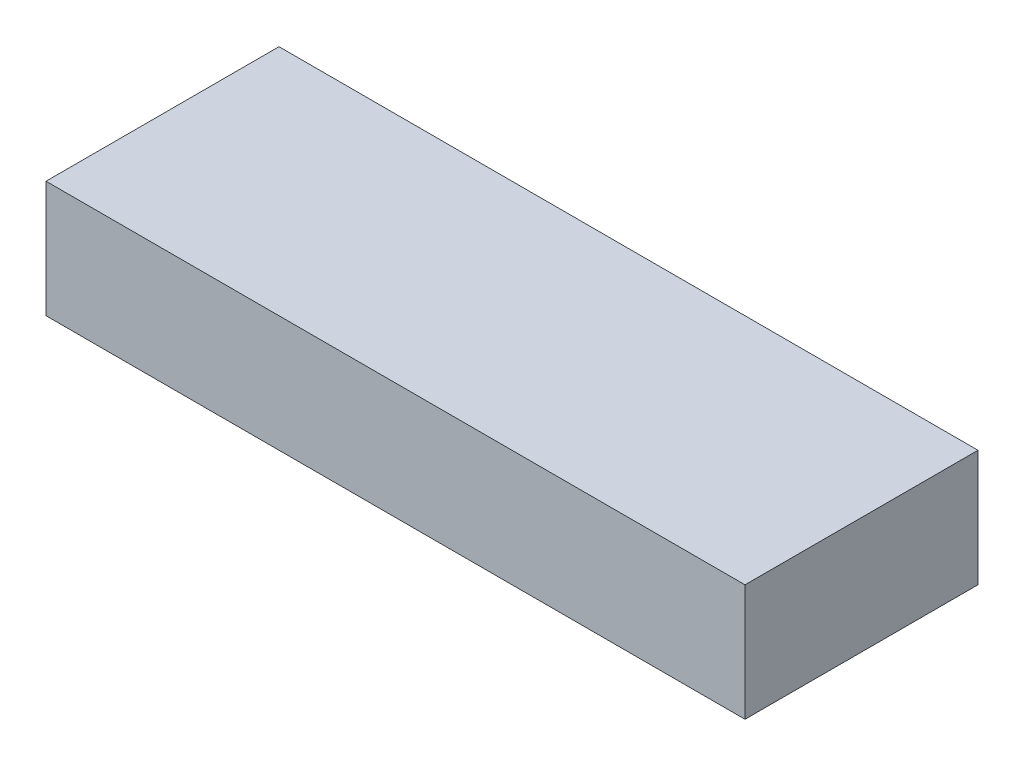
ISO-10303-21;
HEADER;
FILE_DESCRIPTION(('STEP AP214'),'2;1');
FILE_NAME('part.step','',(''),(''),'','','');
FILE_SCHEMA(('AUTOMOTIVE_DESIGN { 1 0 10303 214 1 1 1 1 }'));
ENDSEC;
DATA;
#1=APPLICATION_CONTEXT('core data for automotive mechanical design processes');
#2=APPLICATION_PROTOCOL_DEFINITION('international standard','automotive_design',2000,#1);
#3=PRODUCT_CONTEXT('',#1,'mechanical');
#4=PRODUCT('Part','Part','',(#3));
#5=PRODUCT_RELATED_PRODUCT_CATEGORY('part','',(#4));
#6=PRODUCT_DEFINITION_FORMATION('','',#4);
#7=PRODUCT_DEFINITION_CONTEXT('part definition',#1,'design');
#8=PRODUCT_DEFINITION('design','',#6,#7);
#9=PRODUCT_DEFINITION_SHAPE('','',#8);
#10=(LENGTH_UNIT() NAMED_UNIT(*) SI_UNIT(.MILLI.,.METRE.));
#11=(NAMED_UNIT(*) PLANE_ANGLE_UNIT() SI_UNIT($,.RADIAN.));
#12=(NAMED_UNIT(*) SI_UNIT($,.STERADIAN.) SOLID_ANGLE_UNIT());
#13=UNCERTAINTY_MEASURE_WITH_UNIT(LENGTH_MEASURE(1.E-05),#10,'distance_accuracy_value','');
#14=(GEOMETRIC_REPRESENTATION_CONTEXT(3) GLOBAL_UNCERTAINTY_ASSIGNED_CONTEXT((#13)) GLOBAL_UNIT_ASSIGNED_CONTEXT((#10,
#11,#12)) REPRESENTATION_CONTEXT('',''));
#15=CARTESIAN_POINT('',(0.,0.,0.));
#16=DIRECTION('',(0.,0.,1.));
#17=DIRECTION('',(1.,0.,0.));
#18=AXIS2_PLACEMENT_3D('',#15,#16,#17);
#19=CARTESIAN_POINT('',(152.4,50.8,50.8));
#20=DIRECTION('',(-1.,0.,0.));
#21=DIRECTION('',(0.,0.,1.));
#22=AXIS2_PLACEMENT_3D('',#19,#20,#21);
#23=PLANE('',#22);
#24=DIRECTION('',(0.,0.,-1.));
#25=VECTOR('',#24,1.);
#26=CARTESIAN_POINT('',(152.4,0.,50.8));
#27=LINE('',#26,#25);
#28=CARTESIAN_POINT('',(152.4,0.,50.8));
#29=VERTEX_POINT('',#28);
#30=CARTESIAN_POINT('',(152.4,0.,-50.8));
#31=VERTEX_POINT('',#30);
#32=EDGE_CURVE('E96',#29,#31,#27,.T.);
#33=ORIENTED_EDGE('',*,*,#32,.T.);
#34=DIRECTION('',(0.,-1.,0.));
#35=VECTOR('',#34,1.);
#36=CARTESIAN_POINT('',(152.4,50.8,-50.8));
#37=LINE('',#36,#35);
#38=CARTESIAN_POINT('',(152.4,50.8,-50.8));
#39=VERTEX_POINT('',#38);
#40=EDGE_CURVE('E11',#39,#31,#37,.T.);
#41=ORIENTED_EDGE('',*,*,#40,.F.);
#42=DIRECTION('',(0.,0.,-1.));
#43=VECTOR('',#42,1.);
#44=CARTESIAN_POINT('',(152.4,50.8,50.8));
#45=LINE('',#44,#43);
#46=CARTESIAN_POINT('',(152.4,50.8,50.8));
#47=VERTEX_POINT('',#46);
#48=EDGE_CURVE('E84',#47,#39,#45,.T.);
#49=ORIENTED_EDGE('',*,*,#48,.F.);
#50=DIRECTION('',(0.,-1.,0.));
#51=VECTOR('',#50,1.);
#52=CARTESIAN_POINT('',(152.4,50.8,50.8));
#53=LINE('',#52,#51);
#54=EDGE_CURVE('E92',#47,#29,#53,.T.);
#55=ORIENTED_EDGE('',*,*,#54,.T.);
#56=EDGE_LOOP('',(#33,#41,#49,#55));
#57=FACE_BOUND('',#56,.T.);
#58=ADVANCED_FACE('F33',(#57),#23,.F.);
#59=CARTESIAN_POINT('',(-152.4,50.8,-50.8));
#60=DIRECTION('',(0.,0.,1.));
#61=DIRECTION('',(1.,0.,0.));
#62=AXIS2_PLACEMENT_3D('',#59,#60,#61);
#63=PLANE('',#62);
#64=DIRECTION('',(-1.,0.,0.));
#65=VECTOR('',#64,1.);
#66=CARTESIAN_POINT('',(-152.4,0.,-50.8));
#67=LINE('',#66,#65);
#68=CARTESIAN_POINT('',(-152.4,0.,-50.8));
#69=VERTEX_POINT('',#68);
#70=EDGE_CURVE('E88',#31,#69,#67,.T.);
#71=ORIENTED_EDGE('',*,*,#70,.T.);
#72=DIRECTION('',(0.,-1.,0.));
#73=VECTOR('',#72,1.);
#74=CARTESIAN_POINT('',(-152.4,50.8,-50.8));
#75=LINE('',#74,#73);
#76=CARTESIAN_POINT('',(-152.4,50.8,-50.8));
#77=VERTEX_POINT('',#76);
#78=EDGE_CURVE('E41',#77,#69,#75,.T.);
#79=ORIENTED_EDGE('',*,*,#78,.F.);
#80=DIRECTION('',(-1.,0.,0.));
#81=VECTOR('',#80,1.);
#82=CARTESIAN_POINT('',(-152.4,50.8,-50.8));
#83=LINE('',#82,#81);
#84=EDGE_CURVE('E79',#39,#77,#83,.T.);
#85=ORIENTED_EDGE('',*,*,#84,.F.);
#86=ORIENTED_EDGE('',*,*,#40,.T.);
#87=EDGE_LOOP('',(#71,#79,#85,#86));
#88=FACE_BOUND('',#87,.T.);
#89=ADVANCED_FACE('F87',(#88),#63,.F.);
#90=CARTESIAN_POINT('',(-152.4,50.8,50.8));
#91=DIRECTION('',(1.,0.,0.));
#92=DIRECTION('',(0.,0.,-1.));
#93=AXIS2_PLACEMENT_3D('',#90,#91,#92);
#94=PLANE('',#93);
#95=DIRECTION('',(0.,0.,1.));
#96=VECTOR('',#95,1.);
#97=CARTESIAN_POINT('',(-152.4,0.,50.8));
#98=LINE('',#97,#96);
#99=CARTESIAN_POINT('',(-152.4,0.,50.8));
#100=VERTEX_POINT('',#99);
#101=EDGE_CURVE('E66',#69,#100,#98,.T.);
#102=ORIENTED_EDGE('',*,*,#101,.T.);
#103=DIRECTION('',(0.,-1.,0.));
#104=VECTOR('',#103,1.);
#105=CARTESIAN_POINT('',(-152.4,50.8,50.8));
#106=LINE('',#105,#104);
#107=CARTESIAN_POINT('',(-152.4,50.8,50.8));
#108=VERTEX_POINT('',#107);
#109=EDGE_CURVE('E89',#108,#100,#106,.T.);
#110=ORIENTED_EDGE('',*,*,#109,.F.);
#111=DIRECTION('',(0.,0.,1.));
#112=VECTOR('',#111,1.);
#113=CARTESIAN_POINT('',(-152.4,50.8,50.8));
#114=LINE('',#113,#112);
#115=EDGE_CURVE('E82',#77,#108,#114,.T.);
#116=ORIENTED_EDGE('',*,*,#115,.F.);
#117=ORIENTED_EDGE('',*,*,#78,.T.);
#118=EDGE_LOOP('',(#102,#110,#116,#117));
#119=FACE_BOUND('',#118,.T.);
#120=ADVANCED_FACE('F90',(#119),#94,.F.);
#121=CARTESIAN_POINT('',(-152.4,50.8,50.8));
#122=DIRECTION('',(0.,0.,-1.));
#123=DIRECTION('',(-1.,0.,0.));
#124=AXIS2_PLACEMENT_3D('',#121,#122,#123);
#125=PLANE('',#124);
#126=DIRECTION('',(1.,0.,0.));
#127=VECTOR('',#126,1.);
#128=CARTESIAN_POINT('',(-152.4,0.,50.8));
#129=LINE('',#128,#127);
#130=EDGE_CURVE('E72',#100,#29,#129,.T.);
#131=ORIENTED_EDGE('',*,*,#130,.T.);
#132=ORIENTED_EDGE('',*,*,#54,.F.);
#133=DIRECTION('',(1.,0.,0.));
#134=VECTOR('',#133,1.);
#135=CARTESIAN_POINT('',(-152.4,50.8,50.8));
#136=LINE('',#135,#134);
#137=EDGE_CURVE('E49',#108,#47,#136,.T.);
#138=ORIENTED_EDGE('',*,*,#137,.F.);
#139=ORIENTED_EDGE('',*,*,#109,.T.);
#140=EDGE_LOOP('',(#131,#132,#138,#139));
#141=FACE_BOUND('',#140,.T.);
#142=ADVANCED_FACE('F103',(#141),#125,.F.);
#143=CARTESIAN_POINT('',(0.,50.8,0.));
#144=DIRECTION('',(0.,-1.,0.));
#145=DIRECTION('',(0.,0.,-1.));
#146=AXIS2_PLACEMENT_3D('',#143,#144,#145);
#147=PLANE('',#146);
#148=ORIENTED_EDGE('',*,*,#48,.T.);
#149=ORIENTED_EDGE('',*,*,#84,.T.);
#150=ORIENTED_EDGE('',*,*,#115,.T.);
#151=ORIENTED_EDGE('',*,*,#137,.T.);
#152=EDGE_LOOP('',(#148,#149,#150,#151));
#153=FACE_BOUND('',#152,.T.);
#154=ADVANCED_FACE('F80',(#153),#147,.F.);
#155=CARTESIAN_POINT('',(0.,0.,0.));
#156=DIRECTION('',(0.,-1.,0.));
#157=DIRECTION('',(0.,0.,-1.));
#158=AXIS2_PLACEMENT_3D('',#155,#156,#157);
#159=PLANE('',#158);
#160=ORIENTED_EDGE('',*,*,#32,.F.);
#161=ORIENTED_EDGE('',*,*,#130,.F.);
#162=ORIENTED_EDGE('',*,*,#101,.F.);
#163=ORIENTED_EDGE('',*,*,#70,.F.);
#164=EDGE_LOOP('',(#160,#161,#162,#163));
#165=FACE_BOUND('',#164,.T.);
#166=ADVANCED_FACE('F106',(#165),#159,.T.);
#167=CLOSED_SHELL('',(#58,#89,#120,#142,#154,#166));
#168=MANIFOLD_SOLID_BREP('B2',#167);
#169=ADVANCED_BREP_SHAPE_REPRESENTATION('',(#18,#168),#14);
#170=SHAPE_DEFINITION_REPRESENTATION(#9,#169);
ENDSEC;
END-ISO-10303-21;
